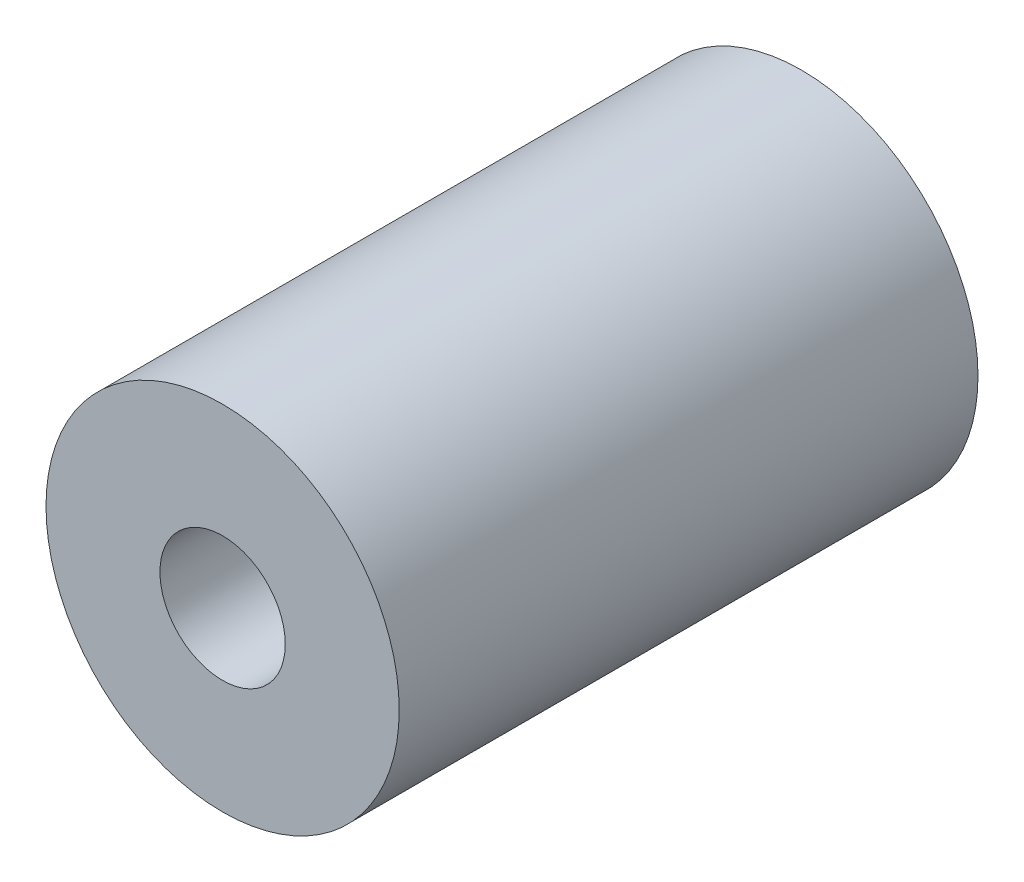
ISO-10303-21;
HEADER;
FILE_DESCRIPTION(('STEP AP214'),'2;1');
FILE_NAME('part.step','',(''),(''),'','','');
FILE_SCHEMA(('AUTOMOTIVE_DESIGN { 1 0 10303 214 1 1 1 1 }'));
ENDSEC;
DATA;
#1=APPLICATION_CONTEXT('core data for automotive mechanical design processes');
#2=APPLICATION_PROTOCOL_DEFINITION('international standard','automotive_design',2000,#1);
#3=PRODUCT_CONTEXT('',#1,'mechanical');
#4=PRODUCT('Part','Part','',(#3));
#5=PRODUCT_RELATED_PRODUCT_CATEGORY('part','',(#4));
#6=PRODUCT_DEFINITION_FORMATION('','',#4);
#7=PRODUCT_DEFINITION_CONTEXT('part definition',#1,'design');
#8=PRODUCT_DEFINITION('design','',#6,#7);
#9=PRODUCT_DEFINITION_SHAPE('','',#8);
#10=(LENGTH_UNIT() NAMED_UNIT(*) SI_UNIT(.MILLI.,.METRE.));
#11=(NAMED_UNIT(*) PLANE_ANGLE_UNIT() SI_UNIT($,.RADIAN.));
#12=(NAMED_UNIT(*) SI_UNIT($,.STERADIAN.) SOLID_ANGLE_UNIT());
#13=UNCERTAINTY_MEASURE_WITH_UNIT(LENGTH_MEASURE(1.E-05),#10,'distance_accuracy_value','');
#14=(GEOMETRIC_REPRESENTATION_CONTEXT(3) GLOBAL_UNCERTAINTY_ASSIGNED_CONTEXT((#13)) GLOBAL_UNIT_ASSIGNED_CONTEXT((#10,
#11,#12)) REPRESENTATION_CONTEXT('',''));
#15=CARTESIAN_POINT('',(0.,0.,0.));
#16=DIRECTION('',(0.,0.,1.));
#17=DIRECTION('',(1.,0.,0.));
#18=AXIS2_PLACEMENT_3D('',#15,#16,#17);
#19=CARTESIAN_POINT('',(0.,0.,12.7));
#20=DIRECTION('',(0.,0.,1.));
#21=DIRECTION('',(1.,0.,0.));
#22=AXIS2_PLACEMENT_3D('',#19,#20,#21);
#23=PLANE('',#22);
#24=CARTESIAN_POINT('',(0.,0.,12.7));
#25=DIRECTION('',(0.,0.,1.));
#26=DIRECTION('',(1.,0.,0.));
#27=AXIS2_PLACEMENT_3D('',#24,#25,#26);
#28=CIRCLE('',#27,7.75);
#29=CARTESIAN_POINT('',(7.75,0.,12.7));
#30=VERTEX_POINT('',#29);
#31=EDGE_CURVE('E10',#30,#30,#28,.T.);
#32=ORIENTED_EDGE('',*,*,#31,.T.);
#33=EDGE_LOOP('',(#32));
#34=FACE_BOUND('',#33,.T.);
#35=CARTESIAN_POINT('',(0.,0.,12.7));
#36=DIRECTION('',(0.,0.,1.));
#37=DIRECTION('',(1.,0.,0.));
#38=AXIS2_PLACEMENT_3D('',#35,#36,#37);
#39=CIRCLE('',#38,2.75);
#40=CARTESIAN_POINT('',(2.75,0.,12.7));
#41=VERTEX_POINT('',#40);
#42=EDGE_CURVE('E45',#41,#41,#39,.T.);
#43=ORIENTED_EDGE('',*,*,#42,.F.);
#44=EDGE_LOOP('',(#43));
#45=FACE_BOUND('',#44,.T.);
#46=ADVANCED_FACE('F34',(#34,#45),#23,.T.);
#47=CARTESIAN_POINT('',(0.,0.,-12.7));
#48=DIRECTION('',(0.,0.,1.));
#49=DIRECTION('',(1.,0.,0.));
#50=AXIS2_PLACEMENT_3D('',#47,#48,#49);
#51=PLANE('',#50);
#52=CARTESIAN_POINT('',(0.,0.,-12.7));
#53=DIRECTION('',(0.,0.,1.));
#54=DIRECTION('',(1.,0.,0.));
#55=AXIS2_PLACEMENT_3D('',#52,#53,#54);
#56=CIRCLE('',#55,7.75);
#57=CARTESIAN_POINT('',(7.75,0.,-12.7));
#58=VERTEX_POINT('',#57);
#59=EDGE_CURVE('E38',#58,#58,#56,.T.);
#60=ORIENTED_EDGE('',*,*,#59,.F.);
#61=EDGE_LOOP('',(#60));
#62=FACE_BOUND('',#61,.T.);
#63=CARTESIAN_POINT('',(0.,0.,-12.7));
#64=DIRECTION('',(0.,0.,1.));
#65=DIRECTION('',(1.,0.,0.));
#66=AXIS2_PLACEMENT_3D('',#63,#64,#65);
#67=CIRCLE('',#66,2.75);
#68=CARTESIAN_POINT('',(2.75,0.,-12.7));
#69=VERTEX_POINT('',#68);
#70=EDGE_CURVE('E47',#69,#69,#67,.T.);
#71=ORIENTED_EDGE('',*,*,#70,.T.);
#72=EDGE_LOOP('',(#71));
#73=FACE_BOUND('',#72,.T.);
#74=ADVANCED_FACE('F57',(#62,#73),#51,.F.);
#75=CARTESIAN_POINT('',(0.,0.,12.7));
#76=DIRECTION('',(0.,0.,-1.));
#77=DIRECTION('',(-1.,0.,0.));
#78=AXIS2_PLACEMENT_3D('',#75,#76,#77);
#79=CYLINDRICAL_SURFACE('',#78,7.75);
#80=ORIENTED_EDGE('',*,*,#31,.F.);
#81=EDGE_LOOP('',(#80));
#82=FACE_BOUND('',#81,.T.);
#83=ORIENTED_EDGE('',*,*,#59,.T.);
#84=EDGE_LOOP('',(#83));
#85=FACE_BOUND('',#84,.T.);
#86=ADVANCED_FACE('F36',(#82,#85),#79,.T.);
#87=CARTESIAN_POINT('',(0.,0.,12.7));
#88=DIRECTION('',(0.,0.,-1.));
#89=DIRECTION('',(-1.,0.,0.));
#90=AXIS2_PLACEMENT_3D('',#87,#88,#89);
#91=CYLINDRICAL_SURFACE('',#90,2.75);
#92=ORIENTED_EDGE('',*,*,#42,.T.);
#93=EDGE_LOOP('',(#92));
#94=FACE_BOUND('',#93,.T.);
#95=ORIENTED_EDGE('',*,*,#70,.F.);
#96=EDGE_LOOP('',(#95));
#97=FACE_BOUND('',#96,.T.);
#98=ADVANCED_FACE('F53',(#94,#97),#91,.F.);
#99=CLOSED_SHELL('',(#46,#74,#86,#98));
#100=MANIFOLD_SOLID_BREP('B2',#99);
#101=ADVANCED_BREP_SHAPE_REPRESENTATION('',(#18,#100),#14);
#102=SHAPE_DEFINITION_REPRESENTATION(#9,#101);
ENDSEC;
END-ISO-10303-21;
